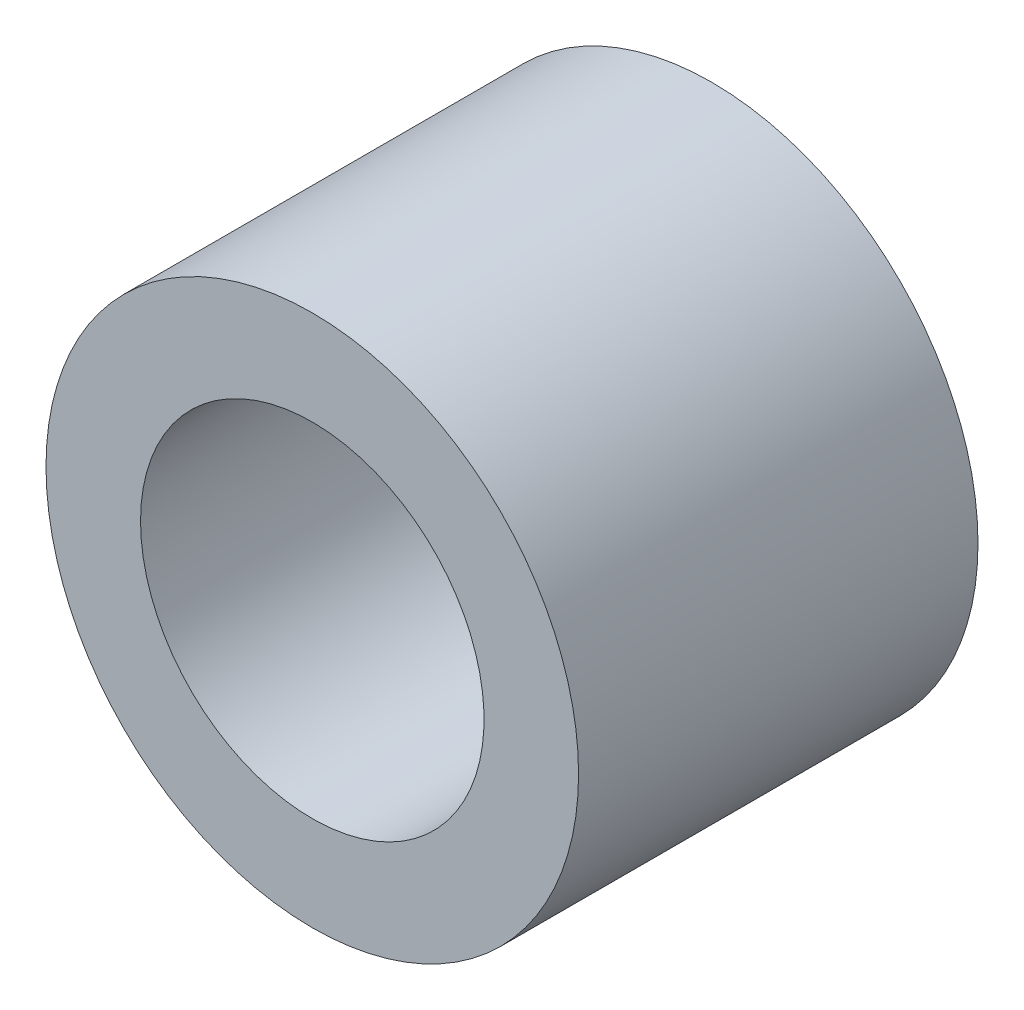
ISO-10303-21;
HEADER;
FILE_DESCRIPTION(('STEP AP214'),'2;1');
FILE_NAME('part.step','',(''),(''),'','','');
FILE_SCHEMA(('AUTOMOTIVE_DESIGN { 1 0 10303 214 1 1 1 1 }'));
ENDSEC;
DATA;
#1=APPLICATION_CONTEXT('core data for automotive mechanical design processes');
#2=APPLICATION_PROTOCOL_DEFINITION('international standard','automotive_design',2000,#1);
#3=PRODUCT_CONTEXT('',#1,'mechanical');
#4=PRODUCT('Part','Part','',(#3));
#5=PRODUCT_RELATED_PRODUCT_CATEGORY('part','',(#4));
#6=PRODUCT_DEFINITION_FORMATION('','',#4);
#7=PRODUCT_DEFINITION_CONTEXT('part definition',#1,'design');
#8=PRODUCT_DEFINITION('design','',#6,#7);
#9=PRODUCT_DEFINITION_SHAPE('','',#8);
#10=(LENGTH_UNIT() NAMED_UNIT(*) SI_UNIT(.MILLI.,.METRE.));
#11=(NAMED_UNIT(*) PLANE_ANGLE_UNIT() SI_UNIT($,.RADIAN.));
#12=(NAMED_UNIT(*) SI_UNIT($,.STERADIAN.) SOLID_ANGLE_UNIT());
#13=UNCERTAINTY_MEASURE_WITH_UNIT(LENGTH_MEASURE(1.E-05),#10,'distance_accuracy_value','');
#14=(GEOMETRIC_REPRESENTATION_CONTEXT(3) GLOBAL_UNCERTAINTY_ASSIGNED_CONTEXT((#13)) GLOBAL_UNIT_ASSIGNED_CONTEXT((#10,
#11,#12)) REPRESENTATION_CONTEXT('',''));
#15=CARTESIAN_POINT('',(0.,0.,0.));
#16=DIRECTION('',(0.,0.,1.));
#17=DIRECTION('',(1.,0.,0.));
#18=AXIS2_PLACEMENT_3D('',#15,#16,#17);
#19=CARTESIAN_POINT('',(0.,0.,3.81));
#20=DIRECTION('',(0.,0.,1.));
#21=DIRECTION('',(1.,0.,0.));
#22=AXIS2_PLACEMENT_3D('',#19,#20,#21);
#23=PLANE('',#22);
#24=CARTESIAN_POINT('',(0.,0.,3.81));
#25=DIRECTION('',(0.,0.,1.));
#26=DIRECTION('',(1.,0.,0.));
#27=AXIS2_PLACEMENT_3D('',#24,#25,#26);
#28=CIRCLE('',#27,2.54);
#29=CARTESIAN_POINT('',(-2.54,0.,3.81));
#30=VERTEX_POINT('',#29);
#31=EDGE_CURVE('E10',#30,#30,#28,.T.);
#32=ORIENTED_EDGE('',*,*,#31,.T.);
#33=EDGE_LOOP('',(#32));
#34=FACE_BOUND('',#33,.T.);
#35=CARTESIAN_POINT('',(0.,0.,3.81));
#36=DIRECTION('',(0.,0.,1.));
#37=DIRECTION('',(1.,0.,0.));
#38=AXIS2_PLACEMENT_3D('',#35,#36,#37);
#39=CIRCLE('',#38,1.6383);
#40=CARTESIAN_POINT('',(-1.6383,0.,3.81));
#41=VERTEX_POINT('',#40);
#42=EDGE_CURVE('E48',#41,#41,#39,.T.);
#43=ORIENTED_EDGE('',*,*,#42,.F.);
#44=EDGE_LOOP('',(#43));
#45=FACE_BOUND('',#44,.T.);
#46=ADVANCED_FACE('F37',(#34,#45),#23,.T.);
#47=CARTESIAN_POINT('',(0.,0.,0.));
#48=DIRECTION('',(0.,0.,1.));
#49=DIRECTION('',(1.,0.,0.));
#50=AXIS2_PLACEMENT_3D('',#47,#48,#49);
#51=PLANE('',#50);
#52=CARTESIAN_POINT('',(0.,0.,0.));
#53=DIRECTION('',(0.,0.,1.));
#54=DIRECTION('',(1.,0.,0.));
#55=AXIS2_PLACEMENT_3D('',#52,#53,#54);
#56=CIRCLE('',#55,2.54);
#57=CARTESIAN_POINT('',(-2.54,0.,0.));
#58=VERTEX_POINT('',#57);
#59=EDGE_CURVE('E41',#58,#58,#56,.T.);
#60=ORIENTED_EDGE('',*,*,#59,.F.);
#61=EDGE_LOOP('',(#60));
#62=FACE_BOUND('',#61,.T.);
#63=CARTESIAN_POINT('',(0.,0.,0.));
#64=DIRECTION('',(0.,0.,1.));
#65=DIRECTION('',(1.,0.,0.));
#66=AXIS2_PLACEMENT_3D('',#63,#64,#65);
#67=CIRCLE('',#66,1.6383);
#68=CARTESIAN_POINT('',(-1.6383,0.,0.));
#69=VERTEX_POINT('',#68);
#70=EDGE_CURVE('E50',#69,#69,#67,.T.);
#71=ORIENTED_EDGE('',*,*,#70,.T.);
#72=EDGE_LOOP('',(#71));
#73=FACE_BOUND('',#72,.T.);
#74=ADVANCED_FACE('F60',(#62,#73),#51,.F.);
#75=CARTESIAN_POINT('',(0.,0.,3.81));
#76=DIRECTION('',(0.,0.,-1.));
#77=DIRECTION('',(-1.,0.,0.));
#78=AXIS2_PLACEMENT_3D('',#75,#76,#77);
#79=CYLINDRICAL_SURFACE('',#78,2.54);
#80=CARTESIAN_POINT('',(-2.54,0.,3.81));
#81=CARTESIAN_POINT('',(-2.54,0.,3.7703125));
#82=CARTESIAN_POINT('',(-2.54,0.,3.730625));
#83=CARTESIAN_POINT('',(-2.54,0.,3.65125));
#84=CARTESIAN_POINT('',(-2.54,0.,3.6115625));
#85=CARTESIAN_POINT('',(-2.54,0.,3.5321875));
#86=CARTESIAN_POINT('',(-2.54,0.,3.4925));
#87=CARTESIAN_POINT('',(-2.54,0.,3.413125));
#88=CARTESIAN_POINT('',(-2.54,0.,3.3734375));
#89=CARTESIAN_POINT('',(-2.54,0.,3.2940625));
#90=CARTESIAN_POINT('',(-2.54,0.,3.254375));
#91=CARTESIAN_POINT('',(-2.54,0.,3.175));
#92=CARTESIAN_POINT('',(-2.54,0.,3.1353125));
#93=CARTESIAN_POINT('',(-2.54,0.,3.0559375));
#94=CARTESIAN_POINT('',(-2.54,0.,3.01625));
#95=CARTESIAN_POINT('',(-2.54,0.,2.936875));
#96=CARTESIAN_POINT('',(-2.54,0.,2.8971875));
#97=CARTESIAN_POINT('',(-2.54,0.,2.8178125));
#98=CARTESIAN_POINT('',(-2.54,0.,2.778125));
#99=CARTESIAN_POINT('',(-2.54,0.,2.69875));
#100=CARTESIAN_POINT('',(-2.54,0.,2.6590625));
#101=CARTESIAN_POINT('',(-2.54,0.,2.5796875));
#102=CARTESIAN_POINT('',(-2.54,0.,2.54));
#103=CARTESIAN_POINT('',(-2.54,0.,2.460625));
#104=CARTESIAN_POINT('',(-2.54,0.,2.4209375));
#105=CARTESIAN_POINT('',(-2.54,0.,2.3415625));
#106=CARTESIAN_POINT('',(-2.54,0.,2.301875));
#107=CARTESIAN_POINT('',(-2.54,0.,2.2225));
#108=CARTESIAN_POINT('',(-2.54,0.,2.1828125));
#109=CARTESIAN_POINT('',(-2.54,0.,2.1034375));
#110=CARTESIAN_POINT('',(-2.54,0.,2.06375));
#111=CARTESIAN_POINT('',(-2.54,0.,1.984375));
#112=CARTESIAN_POINT('',(-2.54,0.,1.9446875));
#113=CARTESIAN_POINT('',(-2.54,0.,1.8653125));
#114=CARTESIAN_POINT('',(-2.54,0.,1.825625));
#115=CARTESIAN_POINT('',(-2.54,0.,1.74625));
#116=CARTESIAN_POINT('',(-2.54,0.,1.7065625));
#117=CARTESIAN_POINT('',(-2.54,0.,1.6271875));
#118=CARTESIAN_POINT('',(-2.54,0.,1.5875));
#119=CARTESIAN_POINT('',(-2.54,0.,1.508125));
#120=CARTESIAN_POINT('',(-2.54,0.,1.4684375));
#121=CARTESIAN_POINT('',(-2.54,0.,1.3890625));
#122=CARTESIAN_POINT('',(-2.54,0.,1.349375));
#123=CARTESIAN_POINT('',(-2.54,0.,1.27));
#124=CARTESIAN_POINT('',(-2.54,0.,1.2303125));
#125=CARTESIAN_POINT('',(-2.54,0.,1.1509375));
#126=CARTESIAN_POINT('',(-2.54,0.,1.11125));
#127=CARTESIAN_POINT('',(-2.54,0.,1.031875));
#128=CARTESIAN_POINT('',(-2.54,0.,0.9921875));
#129=CARTESIAN_POINT('',(-2.54,0.,0.9128125));
#130=CARTESIAN_POINT('',(-2.54,0.,0.873125));
#131=CARTESIAN_POINT('',(-2.54,0.,0.79375));
#132=CARTESIAN_POINT('',(-2.54,0.,0.7540625));
#133=CARTESIAN_POINT('',(-2.54,0.,0.6746875));
#134=CARTESIAN_POINT('',(-2.54,0.,0.635));
#135=CARTESIAN_POINT('',(-2.54,0.,0.555625));
#136=CARTESIAN_POINT('',(-2.54,0.,0.5159375));
#137=CARTESIAN_POINT('',(-2.54,0.,0.4365625));
#138=CARTESIAN_POINT('',(-2.54,0.,0.396875));
#139=CARTESIAN_POINT('',(-2.54,0.,0.3175));
#140=CARTESIAN_POINT('',(-2.54,0.,0.2778125));
#141=CARTESIAN_POINT('',(-2.54,0.,0.1984375));
#142=CARTESIAN_POINT('',(-2.54,0.,0.15875));
#143=CARTESIAN_POINT('',(-2.54,0.,0.0793749999999999));
#144=CARTESIAN_POINT('',(-2.54,0.,0.0396874999999999));
#145=CARTESIAN_POINT('',(-2.54,0.,0.));
#146=B_SPLINE_CURVE_WITH_KNOTS('',3,(#80,#81,#82,#83,#84,#85,#86,#87,#88,#89,#90,#91,#92,#93,
#94,#95,#96,#97,#98,#99,#100,#101,#102,#103,#104,#105,#106,#107,#108,#109,#110,#111,#112,#113,
#114,#115,#116,#117,#118,#119,#120,#121,#122,#123,#124,#125,#126,#127,#128,#129,#130,#131,#132,
#133,#134,#135,#136,#137,#138,#139,#140,#141,#142,#143,#144,#145),.UNSPECIFIED.,.F.,.F.,(4,2,2,
2,2,2,2,2,2,2,2,2,2,2,2,2,2,2,2,2,2,2,2,2,2,2,2,2,2,2,2,2,4),(0.,0.1190625,0.238125,0.3571875,
0.47625,0.5953125,0.714375,0.8334375,0.9525,1.0715625,1.190625,1.3096875,1.42875,1.5478125,
1.666875,1.7859375,1.905,2.0240625,2.143125,2.2621875,2.38125,2.5003125,2.619375,2.7384375,
2.8575,2.9765625,3.095625,3.2146875,3.33375,3.4528125,3.571875,3.6909375,3.81),.UNSPECIFIED.);
#147=EDGE_CURVE('BSEAM39',#30,#58,#146,.T.);
#148=ORIENTED_EDGE('',*,*,#31,.F.);
#149=ORIENTED_EDGE('',*,*,#59,.T.);
#150=ORIENTED_EDGE('',*,*,#147,.T.);
#151=ORIENTED_EDGE('',*,*,#147,.F.);
#152=EDGE_LOOP('',(#148,#150,#149,#151));
#153=FACE_BOUND('',#152,.T.);
#154=ADVANCED_FACE('F39',(#153),#79,.T.);
#155=CARTESIAN_POINT('',(0.,0.,3.81));
#156=DIRECTION('',(0.,0.,-1.));
#157=DIRECTION('',(-1.,0.,0.));
#158=AXIS2_PLACEMENT_3D('',#155,#156,#157);
#159=CYLINDRICAL_SURFACE('',#158,1.6383);
#160=CARTESIAN_POINT('',(-1.6383,0.,3.81));
#161=CARTESIAN_POINT('',(-1.6383,0.,3.7703125));
#162=CARTESIAN_POINT('',(-1.6383,0.,3.730625));
#163=CARTESIAN_POINT('',(-1.6383,0.,3.65125));
#164=CARTESIAN_POINT('',(-1.6383,0.,3.6115625));
#165=CARTESIAN_POINT('',(-1.6383,0.,3.5321875));
#166=CARTESIAN_POINT('',(-1.6383,0.,3.4925));
#167=CARTESIAN_POINT('',(-1.6383,0.,3.413125));
#168=CARTESIAN_POINT('',(-1.6383,0.,3.3734375));
#169=CARTESIAN_POINT('',(-1.6383,0.,3.2940625));
#170=CARTESIAN_POINT('',(-1.6383,0.,3.254375));
#171=CARTESIAN_POINT('',(-1.6383,0.,3.175));
#172=CARTESIAN_POINT('',(-1.6383,0.,3.1353125));
#173=CARTESIAN_POINT('',(-1.6383,0.,3.0559375));
#174=CARTESIAN_POINT('',(-1.6383,0.,3.01625));
#175=CARTESIAN_POINT('',(-1.6383,0.,2.936875));
#176=CARTESIAN_POINT('',(-1.6383,0.,2.8971875));
#177=CARTESIAN_POINT('',(-1.6383,0.,2.8178125));
#178=CARTESIAN_POINT('',(-1.6383,0.,2.778125));
#179=CARTESIAN_POINT('',(-1.6383,0.,2.69875));
#180=CARTESIAN_POINT('',(-1.6383,0.,2.6590625));
#181=CARTESIAN_POINT('',(-1.6383,0.,2.5796875));
#182=CARTESIAN_POINT('',(-1.6383,0.,2.54));
#183=CARTESIAN_POINT('',(-1.6383,0.,2.460625));
#184=CARTESIAN_POINT('',(-1.6383,0.,2.4209375));
#185=CARTESIAN_POINT('',(-1.6383,0.,2.3415625));
#186=CARTESIAN_POINT('',(-1.6383,0.,2.301875));
#187=CARTESIAN_POINT('',(-1.6383,0.,2.2225));
#188=CARTESIAN_POINT('',(-1.6383,0.,2.1828125));
#189=CARTESIAN_POINT('',(-1.6383,0.,2.1034375));
#190=CARTESIAN_POINT('',(-1.6383,0.,2.06375));
#191=CARTESIAN_POINT('',(-1.6383,0.,1.984375));
#192=CARTESIAN_POINT('',(-1.6383,0.,1.9446875));
#193=CARTESIAN_POINT('',(-1.6383,0.,1.8653125));
#194=CARTESIAN_POINT('',(-1.6383,0.,1.825625));
#195=CARTESIAN_POINT('',(-1.6383,0.,1.74625));
#196=CARTESIAN_POINT('',(-1.6383,0.,1.7065625));
#197=CARTESIAN_POINT('',(-1.6383,0.,1.6271875));
#198=CARTESIAN_POINT('',(-1.6383,0.,1.5875));
#199=CARTESIAN_POINT('',(-1.6383,0.,1.508125));
#200=CARTESIAN_POINT('',(-1.6383,0.,1.4684375));
#201=CARTESIAN_POINT('',(-1.6383,0.,1.3890625));
#202=CARTESIAN_POINT('',(-1.6383,0.,1.349375));
#203=CARTESIAN_POINT('',(-1.6383,0.,1.27));
#204=CARTESIAN_POINT('',(-1.6383,0.,1.2303125));
#205=CARTESIAN_POINT('',(-1.6383,0.,1.1509375));
#206=CARTESIAN_POINT('',(-1.6383,0.,1.11125));
#207=CARTESIAN_POINT('',(-1.6383,0.,1.031875));
#208=CARTESIAN_POINT('',(-1.6383,0.,0.9921875));
#209=CARTESIAN_POINT('',(-1.6383,0.,0.9128125));
#210=CARTESIAN_POINT('',(-1.6383,0.,0.873125));
#211=CARTESIAN_POINT('',(-1.6383,0.,0.79375));
#212=CARTESIAN_POINT('',(-1.6383,0.,0.7540625));
#213=CARTESIAN_POINT('',(-1.6383,0.,0.6746875));
#214=CARTESIAN_POINT('',(-1.6383,0.,0.635));
#215=CARTESIAN_POINT('',(-1.6383,0.,0.555625));
#216=CARTESIAN_POINT('',(-1.6383,0.,0.5159375));
#217=CARTESIAN_POINT('',(-1.6383,0.,0.4365625));
#218=CARTESIAN_POINT('',(-1.6383,0.,0.396875));
#219=CARTESIAN_POINT('',(-1.6383,0.,0.3175));
#220=CARTESIAN_POINT('',(-1.6383,0.,0.2778125));
#221=CARTESIAN_POINT('',(-1.6383,0.,0.1984375));
#222=CARTESIAN_POINT('',(-1.6383,0.,0.15875));
#223=CARTESIAN_POINT('',(-1.6383,0.,0.0793749999999999));
#224=CARTESIAN_POINT('',(-1.6383,0.,0.0396874999999999));
#225=CARTESIAN_POINT('',(-1.6383,0.,0.));
#226=B_SPLINE_CURVE_WITH_KNOTS('',3,(#160,#161,#162,#163,#164,#165,#166,#167,#168,#169,#170,
#171,#172,#173,#174,#175,#176,#177,#178,#179,#180,#181,#182,#183,#184,#185,#186,#187,#188,#189,
#190,#191,#192,#193,#194,#195,#196,#197,#198,#199,#200,#201,#202,#203,#204,#205,#206,#207,#208,
#209,#210,#211,#212,#213,#214,#215,#216,#217,#218,#219,#220,#221,#222,#223,#224,#225),
.UNSPECIFIED.,.F.,.F.,(4,2,2,2,2,2,2,2,2,2,2,2,2,2,2,2,2,2,2,2,2,2,2,2,2,2,2,2,2,2,2,2,4),(0.,
0.1190625,0.238125,0.3571875,0.47625,0.5953125,0.714375,0.8334375,0.9525,1.0715625,1.190625,
1.3096875,1.42875,1.5478125,1.666875,1.7859375,1.905,2.0240625,2.143125,2.2621875,2.38125,
2.5003125,2.619375,2.7384375,2.8575,2.9765625,3.095625,3.2146875,3.33375,3.4528125,3.571875,
3.6909375,3.81),.UNSPECIFIED.);
#227=EDGE_CURVE('BSEAM56',#41,#69,#226,.T.);
#228=ORIENTED_EDGE('',*,*,#42,.T.);
#229=ORIENTED_EDGE('',*,*,#70,.F.);
#230=ORIENTED_EDGE('',*,*,#227,.T.);
#231=ORIENTED_EDGE('',*,*,#227,.F.);
#232=EDGE_LOOP('',(#228,#230,#229,#231));
#233=FACE_BOUND('',#232,.T.);
#234=ADVANCED_FACE('F56',(#233),#159,.F.);
#235=CLOSED_SHELL('',(#46,#74,#154,#234));
#236=MANIFOLD_SOLID_BREP('B2',#235);
#237=ADVANCED_BREP_SHAPE_REPRESENTATION('',(#18,#236),#14);
#238=SHAPE_DEFINITION_REPRESENTATION(#9,#237);
ENDSEC;
END-ISO-10303-21;
